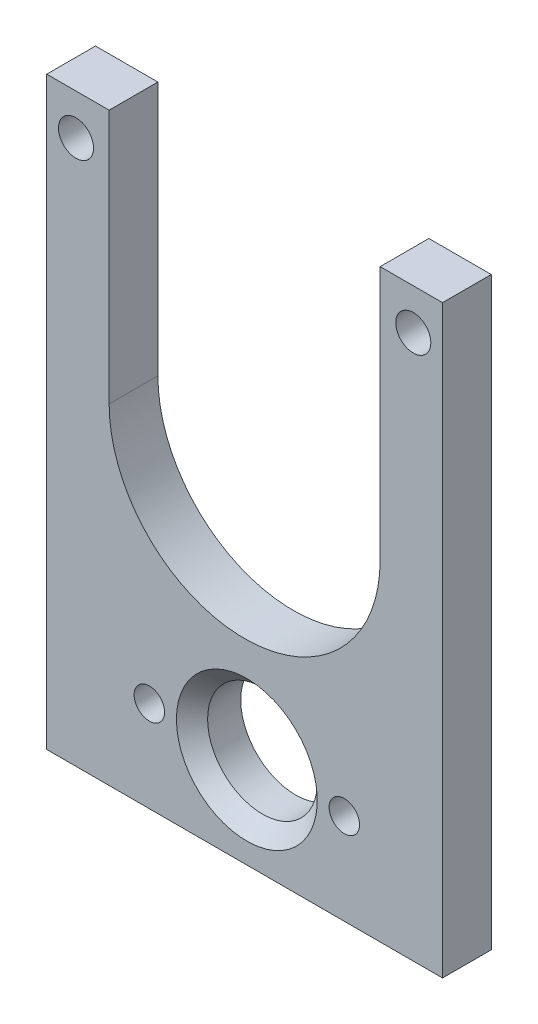
ISO-10303-21;
HEADER;
FILE_DESCRIPTION(('STEP AP214'),'2;1');
FILE_NAME('part.step','',(''),(''),'','','');
FILE_SCHEMA(('AUTOMOTIVE_DESIGN { 1 0 10303 214 1 1 1 1 }'));
ENDSEC;
DATA;
#1=APPLICATION_CONTEXT('core data for automotive mechanical design processes');
#2=APPLICATION_PROTOCOL_DEFINITION('international standard','automotive_design',2000,#1);
#3=PRODUCT_CONTEXT('',#1,'mechanical');
#4=PRODUCT('Part','Part','',(#3));
#5=PRODUCT_RELATED_PRODUCT_CATEGORY('part','',(#4));
#6=PRODUCT_DEFINITION_FORMATION('','',#4);
#7=PRODUCT_DEFINITION_CONTEXT('part definition',#1,'design');
#8=PRODUCT_DEFINITION('design','',#6,#7);
#9=PRODUCT_DEFINITION_SHAPE('','',#8);
#10=(LENGTH_UNIT() NAMED_UNIT(*) SI_UNIT(.MILLI.,.METRE.));
#11=(NAMED_UNIT(*) PLANE_ANGLE_UNIT() SI_UNIT($,.RADIAN.));
#12=(NAMED_UNIT(*) SI_UNIT($,.STERADIAN.) SOLID_ANGLE_UNIT());
#13=UNCERTAINTY_MEASURE_WITH_UNIT(LENGTH_MEASURE(1.E-05),#10,'distance_accuracy_value','');
#14=(GEOMETRIC_REPRESENTATION_CONTEXT(3) GLOBAL_UNCERTAINTY_ASSIGNED_CONTEXT((#13)) GLOBAL_UNIT_ASSIGNED_CONTEXT((#10,
#11,#12)) REPRESENTATION_CONTEXT('',''));
#15=CARTESIAN_POINT('',(0.,0.,0.));
#16=DIRECTION('',(0.,0.,1.));
#17=DIRECTION('',(1.,0.,0.));
#18=AXIS2_PLACEMENT_3D('',#15,#16,#17);
#19=CARTESIAN_POINT('',(-17.9415987895886,64.327559614079,6.35));
#20=DIRECTION('',(-1.,0.,0.));
#21=DIRECTION('',(0.,-1.,0.));
#22=AXIS2_PLACEMENT_3D('',#19,#20,#21);
#23=PLANE('',#22);
#24=DIRECTION('',(0.,0.,1.));
#25=VECTOR('',#24,1.);
#26=CARTESIAN_POINT('',(-17.9415987895886,31.180559614079,-24.9651120165722));
#27=LINE('',#26,#25);
#28=CARTESIAN_POINT('',(-17.9415987895886,31.180559614079,0.));
#29=VERTEX_POINT('',#28);
#30=CARTESIAN_POINT('',(-17.9415987895886,31.180559614079,6.35));
#31=VERTEX_POINT('',#30);
#32=EDGE_CURVE('E137',#29,#31,#27,.T.);
#33=ORIENTED_EDGE('',*,*,#32,.F.);
#34=DIRECTION('',(0.,1.,0.));
#35=VECTOR('',#34,1.);
#36=CARTESIAN_POINT('',(-17.9415987895886,64.327559614079,0.));
#37=LINE('',#36,#35);
#38=CARTESIAN_POINT('',(-17.9415987895886,64.327559614079,0.));
#39=VERTEX_POINT('',#38);
#40=EDGE_CURVE('E126',#29,#39,#37,.T.);
#41=ORIENTED_EDGE('',*,*,#40,.T.);
#42=DIRECTION('',(0.,0.,-1.));
#43=VECTOR('',#42,1.);
#44=CARTESIAN_POINT('',(-17.9415987895886,64.327559614079,6.35));
#45=LINE('',#44,#43);
#46=CARTESIAN_POINT('',(-17.9415987895886,64.327559614079,6.35));
#47=VERTEX_POINT('',#46);
#48=EDGE_CURVE('E196',#47,#39,#45,.T.);
#49=ORIENTED_EDGE('',*,*,#48,.F.);
#50=DIRECTION('',(0.,1.,0.));
#51=VECTOR('',#50,1.);
#52=CARTESIAN_POINT('',(-17.9415987895886,64.327559614079,6.35));
#53=LINE('',#52,#51);
#54=EDGE_CURVE('E138',#31,#47,#53,.T.);
#55=ORIENTED_EDGE('',*,*,#54,.F.);
#56=EDGE_LOOP('',(#33,#41,#49,#55));
#57=FACE_BOUND('',#56,.T.);
#58=ADVANCED_FACE('F59',(#57),#23,.F.);
#59=CARTESIAN_POINT('',(-12.7,0.,0.));
#60=DIRECTION('',(0.,0.,1.));
#61=DIRECTION('',(-1.,0.,0.));
#62=AXIS2_PLACEMENT_3D('',#59,#60,#61);
#63=CYLINDRICAL_SURFACE('',#62,1.984375);
#64=CARTESIAN_POINT('',(-12.7,0.,0.));
#65=DIRECTION('',(0.,0.,-1.));
#66=DIRECTION('',(-1.,0.,0.));
#67=AXIS2_PLACEMENT_3D('',#64,#65,#66);
#68=CIRCLE('',#67,1.984375);
#69=CARTESIAN_POINT('',(-14.684375,0.,0.));
#70=VERTEX_POINT('',#69);
#71=EDGE_CURVE('E210',#70,#70,#68,.T.);
#72=ORIENTED_EDGE('',*,*,#71,.T.);
#73=EDGE_LOOP('',(#72));
#74=FACE_BOUND('',#73,.T.);
#75=CARTESIAN_POINT('',(-12.7,0.,6.35));
#76=DIRECTION('',(0.,0.,-1.));
#77=DIRECTION('',(-1.,0.,0.));
#78=AXIS2_PLACEMENT_3D('',#75,#76,#77);
#79=CIRCLE('',#78,1.984375);
#80=CARTESIAN_POINT('',(-14.684375,0.,6.35));
#81=VERTEX_POINT('',#80);
#82=EDGE_CURVE('E213',#81,#81,#79,.T.);
#83=ORIENTED_EDGE('',*,*,#82,.F.);
#84=EDGE_LOOP('',(#83));
#85=FACE_BOUND('',#84,.T.);
#86=ADVANCED_FACE('F230',(#74,#85),#63,.F.);
#87=CARTESIAN_POINT('',(0.,0.,6.35));
#88=DIRECTION('',(0.,0.,-1.));
#89=DIRECTION('',(-1.,0.,0.));
#90=AXIS2_PLACEMENT_3D('',#87,#88,#89);
#91=PLANE('',#90);
#92=CARTESIAN_POINT('',(0.,0.,6.35));
#93=DIRECTION('',(0.,0.,-1.));
#94=DIRECTION('',(-1.,0.,0.));
#95=AXIS2_PLACEMENT_3D('',#92,#93,#94);
#96=CIRCLE('',#95,9.17575);
#97=CARTESIAN_POINT('',(-9.17575,0.,6.35));
#98=VERTEX_POINT('',#97);
#99=EDGE_CURVE('E12',#98,#98,#96,.T.);
#100=ORIENTED_EDGE('',*,*,#99,.T.);
#101=EDGE_LOOP('',(#100));
#102=FACE_BOUND('',#101,.T.);
#103=ORIENTED_EDGE('',*,*,#82,.T.);
#104=EDGE_LOOP('',(#103));
#105=FACE_BOUND('',#104,.T.);
#106=CARTESIAN_POINT('',(12.7,0.,6.35));
#107=DIRECTION('',(0.,0.,1.));
#108=DIRECTION('',(1.,0.,0.));
#109=AXIS2_PLACEMENT_3D('',#106,#107,#108);
#110=CIRCLE('',#109,1.984375);
#111=CARTESIAN_POINT('',(14.684375,0.,6.35));
#112=VERTEX_POINT('',#111);
#113=EDGE_CURVE('E142',#112,#112,#110,.T.);
#114=ORIENTED_EDGE('',*,*,#113,.F.);
#115=EDGE_LOOP('',(#114));
#116=FACE_BOUND('',#115,.T.);
#117=DIRECTION('',(0.,-1.,0.));
#118=VECTOR('',#117,1.);
#119=CARTESIAN_POINT('',(-26.0695987895886,64.327559614079,6.35));
#120=LINE('',#119,#118);
#121=CARTESIAN_POINT('',(-26.0695987895886,64.327559614079,6.35));
#122=VERTEX_POINT('',#121);
#123=CARTESIAN_POINT('',(-26.0695987895886,-11.872440385921,6.35));
#124=VERTEX_POINT('',#123);
#125=EDGE_CURVE('E168',#122,#124,#120,.T.);
#126=ORIENTED_EDGE('',*,*,#125,.T.);
#127=DIRECTION('',(1.,0.,0.));
#128=VECTOR('',#127,1.);
#129=CARTESIAN_POINT('',(25.4924012104114,-11.872440385921,6.35));
#130=LINE('',#129,#128);
#131=CARTESIAN_POINT('',(25.4924012104114,-11.872440385921,6.35));
#132=VERTEX_POINT('',#131);
#133=EDGE_CURVE('E171',#124,#132,#130,.T.);
#134=ORIENTED_EDGE('',*,*,#133,.T.);
#135=DIRECTION('',(0.,1.,0.));
#136=VECTOR('',#135,1.);
#137=CARTESIAN_POINT('',(25.4924012104114,64.327559614079,6.35));
#138=LINE('',#137,#136);
#139=CARTESIAN_POINT('',(25.4924012104114,64.327559614079,6.35));
#140=VERTEX_POINT('',#139);
#141=EDGE_CURVE('E173',#132,#140,#138,.T.);
#142=ORIENTED_EDGE('',*,*,#141,.T.);
#143=DIRECTION('',(-1.,0.,0.));
#144=VECTOR('',#143,1.);
#145=CARTESIAN_POINT('',(17.3644012104114,64.327559614079,6.35));
#146=LINE('',#145,#144);
#147=CARTESIAN_POINT('',(17.3644012104114,64.327559614079,6.35));
#148=VERTEX_POINT('',#147);
#149=EDGE_CURVE('E175',#140,#148,#146,.T.);
#150=ORIENTED_EDGE('',*,*,#149,.T.);
#151=DIRECTION('',(0.,-1.,0.));
#152=VECTOR('',#151,1.);
#153=CARTESIAN_POINT('',(17.3644012104114,13.527559614079,6.35));
#154=LINE('',#153,#152);
#155=CARTESIAN_POINT('',(17.3644012104114,31.180559614079,6.35));
#156=VERTEX_POINT('',#155);
#157=EDGE_CURVE('E177',#148,#156,#154,.T.);
#158=ORIENTED_EDGE('',*,*,#157,.T.);
#159=CARTESIAN_POINT('',(-0.288598789588642,31.180559614079,6.35));
#160=DIRECTION('',(0.,0.,1.));
#161=DIRECTION('',(1.,0.,0.));
#162=AXIS2_PLACEMENT_3D('',#159,#160,#161);
#163=CIRCLE('',#162,17.653);
#164=EDGE_CURVE('E75',#31,#156,#163,.T.);
#165=ORIENTED_EDGE('',*,*,#164,.F.);
#166=ORIENTED_EDGE('',*,*,#54,.T.);
#167=DIRECTION('',(-1.,0.,0.));
#168=VECTOR('',#167,1.);
#169=CARTESIAN_POINT('',(-26.0695987895886,64.327559614079,6.35));
#170=LINE('',#169,#168);
#171=EDGE_CURVE('E181',#47,#122,#170,.T.);
#172=ORIENTED_EDGE('',*,*,#171,.T.);
#173=EDGE_LOOP('',(#126,#134,#142,#150,#158,#165,#166,#172));
#174=FACE_BOUND('',#173,.T.);
#175=CARTESIAN_POINT('',(21.6824012104114,59.024929956,6.35));
#176=DIRECTION('',(0.,0.,1.));
#177=DIRECTION('',(1.,0.,0.));
#178=AXIS2_PLACEMENT_3D('',#175,#176,#177);
#179=CIRCLE('',#178,2.286);
#180=CARTESIAN_POINT('',(23.9684012104113,59.024929956,6.35));
#181=VERTEX_POINT('',#180);
#182=EDGE_CURVE('E159',#181,#181,#179,.T.);
#183=ORIENTED_EDGE('',*,*,#182,.F.);
#184=EDGE_LOOP('',(#183));
#185=FACE_BOUND('',#184,.T.);
#186=CARTESIAN_POINT('',(-22.2595987895886,59.024929956,6.35));
#187=DIRECTION('',(0.,0.,1.));
#188=DIRECTION('',(1.,0.,0.));
#189=AXIS2_PLACEMENT_3D('',#186,#187,#188);
#190=CIRCLE('',#189,2.286);
#191=CARTESIAN_POINT('',(-19.9735987895886,59.024929956,6.35));
#192=VERTEX_POINT('',#191);
#193=EDGE_CURVE('E153',#192,#192,#190,.T.);
#194=ORIENTED_EDGE('',*,*,#193,.F.);
#195=EDGE_LOOP('',(#194));
#196=FACE_BOUND('',#195,.T.);
#197=ADVANCED_FACE('F235',(#102,#105,#116,#174,#185,#196),#91,.F.);
#198=CARTESIAN_POINT('',(0.,0.,0.));
#199=DIRECTION('',(0.,0.,-1.));
#200=DIRECTION('',(-1.,0.,0.));
#201=AXIS2_PLACEMENT_3D('',#198,#199,#200);
#202=PLANE('',#201);
#203=ORIENTED_EDGE('',*,*,#71,.F.);
#204=EDGE_LOOP('',(#203));
#205=FACE_BOUND('',#204,.T.);
#206=CARTESIAN_POINT('',(12.7,0.,0.));
#207=DIRECTION('',(0.,0.,1.));
#208=DIRECTION('',(1.,0.,0.));
#209=AXIS2_PLACEMENT_3D('',#206,#207,#208);
#210=CIRCLE('',#209,1.984375);
#211=CARTESIAN_POINT('',(14.684375,0.,0.));
#212=VERTEX_POINT('',#211);
#213=EDGE_CURVE('E145',#212,#212,#210,.T.);
#214=ORIENTED_EDGE('',*,*,#213,.T.);
#215=EDGE_LOOP('',(#214));
#216=FACE_BOUND('',#215,.T.);
#217=CARTESIAN_POINT('',(21.6824012104114,59.024929956,0.));
#218=DIRECTION('',(0.,0.,1.));
#219=DIRECTION('',(1.,0.,0.));
#220=AXIS2_PLACEMENT_3D('',#217,#218,#219);
#221=CIRCLE('',#220,2.286);
#222=CARTESIAN_POINT('',(23.9684012104113,59.024929956,0.));
#223=VERTEX_POINT('',#222);
#224=EDGE_CURVE('E156',#223,#223,#221,.T.);
#225=ORIENTED_EDGE('',*,*,#224,.T.);
#226=EDGE_LOOP('',(#225));
#227=FACE_BOUND('',#226,.T.);
#228=DIRECTION('',(0.,-1.,0.));
#229=VECTOR('',#228,1.);
#230=CARTESIAN_POINT('',(-26.0695987895886,64.327559614079,0.));
#231=LINE('',#230,#229);
#232=CARTESIAN_POINT('',(-26.0695987895886,64.327559614079,0.));
#233=VERTEX_POINT('',#232);
#234=CARTESIAN_POINT('',(-26.0695987895886,-11.872440385921,0.));
#235=VERTEX_POINT('',#234);
#236=EDGE_CURVE('E167',#233,#235,#231,.T.);
#237=ORIENTED_EDGE('',*,*,#236,.F.);
#238=DIRECTION('',(-1.,0.,0.));
#239=VECTOR('',#238,1.);
#240=CARTESIAN_POINT('',(-26.0695987895886,64.327559614079,0.));
#241=LINE('',#240,#239);
#242=EDGE_CURVE('E131',#39,#233,#241,.T.);
#243=ORIENTED_EDGE('',*,*,#242,.F.);
#244=ORIENTED_EDGE('',*,*,#40,.F.);
#245=CARTESIAN_POINT('',(-0.288598789588642,31.180559614079,0.));
#246=DIRECTION('',(0.,0.,-1.));
#247=DIRECTION('',(-1.,0.,0.));
#248=AXIS2_PLACEMENT_3D('',#245,#246,#247);
#249=CIRCLE('',#248,17.653);
#250=CARTESIAN_POINT('',(17.3644012104114,31.180559614079,0.));
#251=VERTEX_POINT('',#250);
#252=EDGE_CURVE('E83',#29,#251,#249,.F.);
#253=ORIENTED_EDGE('',*,*,#252,.T.);
#254=DIRECTION('',(0.,-1.,0.));
#255=VECTOR('',#254,1.);
#256=CARTESIAN_POINT('',(17.3644012104114,13.527559614079,0.));
#257=LINE('',#256,#255);
#258=CARTESIAN_POINT('',(17.3644012104114,64.327559614079,0.));
#259=VERTEX_POINT('',#258);
#260=EDGE_CURVE('E135',#259,#251,#257,.T.);
#261=ORIENTED_EDGE('',*,*,#260,.F.);
#262=DIRECTION('',(-1.,0.,0.));
#263=VECTOR('',#262,1.);
#264=CARTESIAN_POINT('',(17.3644012104114,64.327559614079,0.));
#265=LINE('',#264,#263);
#266=CARTESIAN_POINT('',(25.4924012104114,64.327559614079,0.));
#267=VERTEX_POINT('',#266);
#268=EDGE_CURVE('E190',#267,#259,#265,.T.);
#269=ORIENTED_EDGE('',*,*,#268,.F.);
#270=DIRECTION('',(0.,1.,0.));
#271=VECTOR('',#270,1.);
#272=CARTESIAN_POINT('',(25.4924012104114,64.327559614079,0.));
#273=LINE('',#272,#271);
#274=CARTESIAN_POINT('',(25.4924012104114,-11.872440385921,0.));
#275=VERTEX_POINT('',#274);
#276=EDGE_CURVE('E188',#275,#267,#273,.T.);
#277=ORIENTED_EDGE('',*,*,#276,.F.);
#278=DIRECTION('',(1.,0.,0.));
#279=VECTOR('',#278,1.);
#280=CARTESIAN_POINT('',(25.4924012104114,-11.872440385921,0.));
#281=LINE('',#280,#279);
#282=EDGE_CURVE('E186',#235,#275,#281,.T.);
#283=ORIENTED_EDGE('',*,*,#282,.F.);
#284=EDGE_LOOP('',(#237,#243,#244,#253,#261,#269,#277,#283));
#285=FACE_BOUND('',#284,.T.);
#286=CARTESIAN_POINT('',(0.,0.,0.));
#287=DIRECTION('',(0.,0.,1.));
#288=DIRECTION('',(1.,0.,0.));
#289=AXIS2_PLACEMENT_3D('',#286,#287,#288);
#290=CIRCLE('',#289,7.14375);
#291=CARTESIAN_POINT('',(7.14375,0.,0.));
#292=VERTEX_POINT('',#291);
#293=EDGE_CURVE('E162',#292,#292,#290,.T.);
#294=ORIENTED_EDGE('',*,*,#293,.T.);
#295=EDGE_LOOP('',(#294));
#296=FACE_BOUND('',#295,.T.);
#297=CARTESIAN_POINT('',(-22.2595987895886,59.024929956,0.));
#298=DIRECTION('',(0.,0.,1.));
#299=DIRECTION('',(1.,0.,0.));
#300=AXIS2_PLACEMENT_3D('',#297,#298,#299);
#301=CIRCLE('',#300,2.286);
#302=CARTESIAN_POINT('',(-19.9735987895886,59.024929956,0.));
#303=VERTEX_POINT('',#302);
#304=EDGE_CURVE('E151',#303,#303,#301,.T.);
#305=ORIENTED_EDGE('',*,*,#304,.T.);
#306=EDGE_LOOP('',(#305));
#307=FACE_BOUND('',#306,.T.);
#308=ADVANCED_FACE('F129',(#205,#216,#227,#285,#296,#307),#202,.T.);
#309=CARTESIAN_POINT('',(-26.0695987895886,64.327559614079,6.35));
#310=DIRECTION('',(1.,0.,0.));
#311=DIRECTION('',(0.,1.,0.));
#312=AXIS2_PLACEMENT_3D('',#309,#310,#311);
#313=PLANE('',#312);
#314=ORIENTED_EDGE('',*,*,#236,.T.);
#315=DIRECTION('',(0.,0.,-1.));
#316=VECTOR('',#315,1.);
#317=CARTESIAN_POINT('',(-26.0695987895886,-11.872440385921,6.35));
#318=LINE('',#317,#316);
#319=EDGE_CURVE('E207',#124,#235,#318,.T.);
#320=ORIENTED_EDGE('',*,*,#319,.F.);
#321=ORIENTED_EDGE('',*,*,#125,.F.);
#322=DIRECTION('',(0.,0.,-1.));
#323=VECTOR('',#322,1.);
#324=CARTESIAN_POINT('',(-26.0695987895886,64.327559614079,6.35));
#325=LINE('',#324,#323);
#326=EDGE_CURVE('E183',#122,#233,#325,.T.);
#327=ORIENTED_EDGE('',*,*,#326,.T.);
#328=EDGE_LOOP('',(#314,#320,#321,#327));
#329=FACE_BOUND('',#328,.T.);
#330=ADVANCED_FACE('F256',(#329),#313,.F.);
#331=CARTESIAN_POINT('',(25.4924012104114,-11.872440385921,6.35));
#332=DIRECTION('',(0.,1.,0.));
#333=DIRECTION('',(0.,0.,1.));
#334=AXIS2_PLACEMENT_3D('',#331,#332,#333);
#335=PLANE('',#334);
#336=ORIENTED_EDGE('',*,*,#282,.T.);
#337=DIRECTION('',(0.,0.,-1.));
#338=VECTOR('',#337,1.);
#339=CARTESIAN_POINT('',(25.4924012104114,-11.872440385921,6.35));
#340=LINE('',#339,#338);
#341=EDGE_CURVE('E204',#132,#275,#340,.T.);
#342=ORIENTED_EDGE('',*,*,#341,.F.);
#343=ORIENTED_EDGE('',*,*,#133,.F.);
#344=ORIENTED_EDGE('',*,*,#319,.T.);
#345=EDGE_LOOP('',(#336,#342,#343,#344));
#346=FACE_BOUND('',#345,.T.);
#347=ADVANCED_FACE('F252',(#346),#335,.F.);
#348=CARTESIAN_POINT('',(25.4924012104114,64.327559614079,6.35));
#349=DIRECTION('',(-1.,0.,0.));
#350=DIRECTION('',(0.,-1.,0.));
#351=AXIS2_PLACEMENT_3D('',#348,#349,#350);
#352=PLANE('',#351);
#353=ORIENTED_EDGE('',*,*,#276,.T.);
#354=DIRECTION('',(0.,0.,-1.));
#355=VECTOR('',#354,1.);
#356=CARTESIAN_POINT('',(25.4924012104114,64.327559614079,6.35));
#357=LINE('',#356,#355);
#358=EDGE_CURVE('E201',#140,#267,#357,.T.);
#359=ORIENTED_EDGE('',*,*,#358,.F.);
#360=ORIENTED_EDGE('',*,*,#141,.F.);
#361=ORIENTED_EDGE('',*,*,#341,.T.);
#362=EDGE_LOOP('',(#353,#359,#360,#361));
#363=FACE_BOUND('',#362,.T.);
#364=ADVANCED_FACE('F248',(#363),#352,.F.);
#365=CARTESIAN_POINT('',(17.3644012104114,64.327559614079,6.35));
#366=DIRECTION('',(0.,-1.,0.));
#367=DIRECTION('',(0.,0.,-1.));
#368=AXIS2_PLACEMENT_3D('',#365,#366,#367);
#369=PLANE('',#368);
#370=ORIENTED_EDGE('',*,*,#268,.T.);
#371=DIRECTION('',(0.,0.,-1.));
#372=VECTOR('',#371,1.);
#373=CARTESIAN_POINT('',(17.3644012104114,64.327559614079,6.35));
#374=LINE('',#373,#372);
#375=EDGE_CURVE('E198',#148,#259,#374,.T.);
#376=ORIENTED_EDGE('',*,*,#375,.F.);
#377=ORIENTED_EDGE('',*,*,#149,.F.);
#378=ORIENTED_EDGE('',*,*,#358,.T.);
#379=EDGE_LOOP('',(#370,#376,#377,#378));
#380=FACE_BOUND('',#379,.T.);
#381=ADVANCED_FACE('F244',(#380),#369,.F.);
#382=CARTESIAN_POINT('',(17.3644012104114,13.527559614079,6.35));
#383=DIRECTION('',(1.,0.,0.));
#384=DIRECTION('',(0.,0.,-1.));
#385=AXIS2_PLACEMENT_3D('',#382,#383,#384);
#386=PLANE('',#385);
#387=ORIENTED_EDGE('',*,*,#260,.T.);
#388=DIRECTION('',(0.,0.,1.));
#389=VECTOR('',#388,1.);
#390=CARTESIAN_POINT('',(17.3644012104114,31.180559614079,-24.9651120165722));
#391=LINE('',#390,#389);
#392=EDGE_CURVE('E139',#251,#156,#391,.T.);
#393=ORIENTED_EDGE('',*,*,#392,.T.);
#394=ORIENTED_EDGE('',*,*,#157,.F.);
#395=ORIENTED_EDGE('',*,*,#375,.T.);
#396=EDGE_LOOP('',(#387,#393,#394,#395));
#397=FACE_BOUND('',#396,.T.);
#398=ADVANCED_FACE('F241',(#397),#386,.F.);
#399=CARTESIAN_POINT('',(-26.0695987895886,64.327559614079,6.35));
#400=DIRECTION('',(0.,-1.,0.));
#401=DIRECTION('',(0.,0.,-1.));
#402=AXIS2_PLACEMENT_3D('',#399,#400,#401);
#403=PLANE('',#402);
#404=ORIENTED_EDGE('',*,*,#242,.T.);
#405=ORIENTED_EDGE('',*,*,#326,.F.);
#406=ORIENTED_EDGE('',*,*,#171,.F.);
#407=ORIENTED_EDGE('',*,*,#48,.T.);
#408=EDGE_LOOP('',(#404,#405,#406,#407));
#409=FACE_BOUND('',#408,.T.);
#410=ADVANCED_FACE('F239',(#409),#403,.F.);
#411=CARTESIAN_POINT('',(0.,0.,6.35));
#412=DIRECTION('',(0.,0.,-1.));
#413=DIRECTION('',(-1.,0.,0.));
#414=AXIS2_PLACEMENT_3D('',#411,#412,#413);
#415=CYLINDRICAL_SURFACE('',#414,7.14375);
#416=CARTESIAN_POINT('',(0.,0.,4.31800000000002));
#417=DIRECTION('',(0.,0.,-1.));
#418=DIRECTION('',(-1.,0.,0.));
#419=AXIS2_PLACEMENT_3D('',#416,#417,#418);
#420=CIRCLE('',#419,7.14375);
#421=CARTESIAN_POINT('',(-7.14375,0.,4.31800000000002));
#422=VERTEX_POINT('',#421);
#423=EDGE_CURVE('E68',#422,#422,#420,.F.);
#424=ORIENTED_EDGE('',*,*,#423,.T.);
#425=EDGE_LOOP('',(#424));
#426=FACE_BOUND('',#425,.T.);
#427=ORIENTED_EDGE('',*,*,#293,.F.);
#428=EDGE_LOOP('',(#427));
#429=FACE_BOUND('',#428,.T.);
#430=ADVANCED_FACE('F218',(#426,#429),#415,.F.);
#431=CARTESIAN_POINT('',(21.6824012104114,59.024929956,6.35));
#432=DIRECTION('',(0.,0.,-1.));
#433=DIRECTION('',(-1.,0.,0.));
#434=AXIS2_PLACEMENT_3D('',#431,#432,#433);
#435=CYLINDRICAL_SURFACE('',#434,2.286);
#436=ORIENTED_EDGE('',*,*,#182,.T.);
#437=EDGE_LOOP('',(#436));
#438=FACE_BOUND('',#437,.T.);
#439=ORIENTED_EDGE('',*,*,#224,.F.);
#440=EDGE_LOOP('',(#439));
#441=FACE_BOUND('',#440,.T.);
#442=ADVANCED_FACE('F280',(#438,#441),#435,.F.);
#443=CARTESIAN_POINT('',(-22.2595987895886,59.024929956,6.35));
#444=DIRECTION('',(0.,0.,-1.));
#445=DIRECTION('',(-1.,0.,0.));
#446=AXIS2_PLACEMENT_3D('',#443,#444,#445);
#447=CYLINDRICAL_SURFACE('',#446,2.286);
#448=ORIENTED_EDGE('',*,*,#193,.T.);
#449=EDGE_LOOP('',(#448));
#450=FACE_BOUND('',#449,.T.);
#451=ORIENTED_EDGE('',*,*,#304,.F.);
#452=EDGE_LOOP('',(#451));
#453=FACE_BOUND('',#452,.T.);
#454=ADVANCED_FACE('F285',(#450,#453),#447,.F.);
#455=CARTESIAN_POINT('',(12.7,0.,0.));
#456=DIRECTION('',(0.,0.,1.));
#457=DIRECTION('',(1.,0.,0.));
#458=AXIS2_PLACEMENT_3D('',#455,#456,#457);
#459=CYLINDRICAL_SURFACE('',#458,1.984375);
#460=ORIENTED_EDGE('',*,*,#213,.F.);
#461=EDGE_LOOP('',(#460));
#462=FACE_BOUND('',#461,.T.);
#463=ORIENTED_EDGE('',*,*,#113,.T.);
#464=EDGE_LOOP('',(#463));
#465=FACE_BOUND('',#464,.T.);
#466=ADVANCED_FACE('F226',(#462,#465),#459,.F.);
#467=CARTESIAN_POINT('',(-0.288598789588642,31.180559614079,-24.9651120165722));
#468=DIRECTION('',(0.,0.,1.));
#469=DIRECTION('',(1.,0.,0.));
#470=AXIS2_PLACEMENT_3D('',#467,#468,#469);
#471=CYLINDRICAL_SURFACE('',#470,17.653);
#472=ORIENTED_EDGE('',*,*,#252,.F.);
#473=ORIENTED_EDGE('',*,*,#32,.T.);
#474=ORIENTED_EDGE('',*,*,#164,.T.);
#475=ORIENTED_EDGE('',*,*,#392,.F.);
#476=EDGE_LOOP('',(#472,#473,#474,#475));
#477=FACE_BOUND('',#476,.T.);
#478=ADVANCED_FACE('F141',(#477),#471,.F.);
#479=CARTESIAN_POINT('',(0.,0.,4.31800000000002));
#480=DIRECTION('',(0.,0.,1.));
#481=DIRECTION('',(1.,0.,0.));
#482=AXIS2_PLACEMENT_3D('',#479,#480,#481);
#483=CONICAL_SURFACE('',#482,7.14375,0.785398163397452);
#484=ORIENTED_EDGE('',*,*,#99,.F.);
#485=EDGE_LOOP('',(#484));
#486=FACE_BOUND('',#485,.T.);
#487=ORIENTED_EDGE('',*,*,#423,.F.);
#488=EDGE_LOOP('',(#487));
#489=FACE_BOUND('',#488,.T.);
#490=ADVANCED_FACE('F62',(#486,#489),#483,.F.);
#491=CLOSED_SHELL('',(#58,#86,#197,#308,#330,#347,#364,#381,#398,#410,#430,#442,#454,#466,#478,#490));
#492=MANIFOLD_SOLID_BREP('B2',#491);
#493=ADVANCED_BREP_SHAPE_REPRESENTATION('',(#18,#492),#14);
#494=SHAPE_DEFINITION_REPRESENTATION(#9,#493);
ENDSEC;
END-ISO-10303-21;
